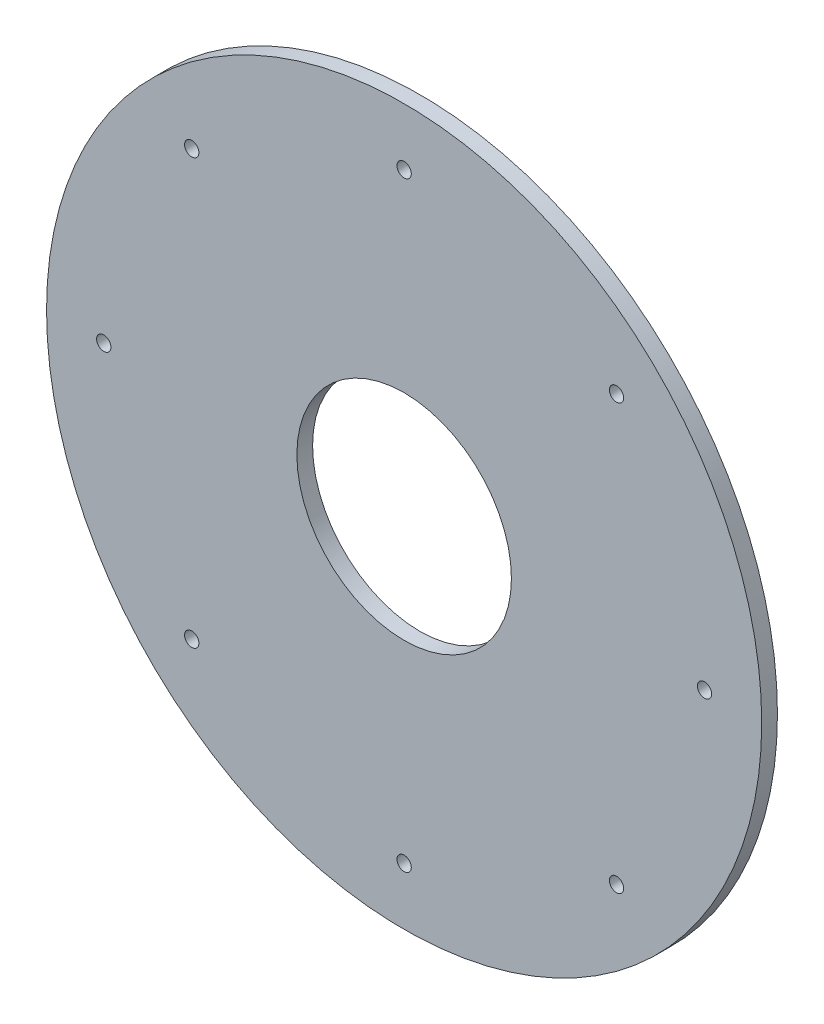
ISO-10303-21;
HEADER;
FILE_DESCRIPTION(('STEP AP214'),'2;1');
FILE_NAME('part.step','',(''),(''),'','','');
FILE_SCHEMA(('AUTOMOTIVE_DESIGN { 1 0 10303 214 1 1 1 1 }'));
ENDSEC;
DATA;
#1=APPLICATION_CONTEXT('core data for automotive mechanical design processes');
#2=APPLICATION_PROTOCOL_DEFINITION('international standard','automotive_design',2000,#1);
#3=PRODUCT_CONTEXT('',#1,'mechanical');
#4=PRODUCT('Part','Part','',(#3));
#5=PRODUCT_RELATED_PRODUCT_CATEGORY('part','',(#4));
#6=PRODUCT_DEFINITION_FORMATION('','',#4);
#7=PRODUCT_DEFINITION_CONTEXT('part definition',#1,'design');
#8=PRODUCT_DEFINITION('design','',#6,#7);
#9=PRODUCT_DEFINITION_SHAPE('','',#8);
#10=(LENGTH_UNIT() NAMED_UNIT(*) SI_UNIT(.MILLI.,.METRE.));
#11=(NAMED_UNIT(*) PLANE_ANGLE_UNIT() SI_UNIT($,.RADIAN.));
#12=(NAMED_UNIT(*) SI_UNIT($,.STERADIAN.) SOLID_ANGLE_UNIT());
#13=UNCERTAINTY_MEASURE_WITH_UNIT(LENGTH_MEASURE(1.E-05),#10,'distance_accuracy_value','');
#14=(GEOMETRIC_REPRESENTATION_CONTEXT(3) GLOBAL_UNCERTAINTY_ASSIGNED_CONTEXT((#13)) GLOBAL_UNIT_ASSIGNED_CONTEXT((#10,
#11,#12)) REPRESENTATION_CONTEXT('',''));
#15=CARTESIAN_POINT('',(0.,0.,0.));
#16=DIRECTION('',(0.,0.,1.));
#17=DIRECTION('',(1.,0.,0.));
#18=AXIS2_PLACEMENT_3D('',#15,#16,#17);
#19=CARTESIAN_POINT('',(0.,0.,11.));
#20=DIRECTION('',(0.,0.,1.));
#21=DIRECTION('',(1.,0.,0.));
#22=AXIS2_PLACEMENT_3D('',#19,#20,#21);
#23=PLANE('',#22);
#24=CARTESIAN_POINT('',(0.,210.,11.));
#25=DIRECTION('',(0.,0.,1.));
#26=DIRECTION('',(1.,0.,0.));
#27=AXIS2_PLACEMENT_3D('',#24,#25,#26);
#28=CIRCLE('',#27,5.);
#29=CARTESIAN_POINT('',(5.,210.,11.));
#30=VERTEX_POINT('',#29);
#31=EDGE_CURVE('E91',#30,#30,#28,.T.);
#32=ORIENTED_EDGE('',*,*,#31,.F.);
#33=EDGE_LOOP('',(#32));
#34=FACE_BOUND('',#33,.T.);
#35=CARTESIAN_POINT('',(148.492424049175,148.492424049175,11.));
#36=DIRECTION('',(0.,0.,1.));
#37=DIRECTION('',(1.,0.,0.));
#38=AXIS2_PLACEMENT_3D('',#35,#36,#37);
#39=CIRCLE('',#38,4.99999999999999);
#40=CARTESIAN_POINT('',(153.492424049175,148.492424049175,11.));
#41=VERTEX_POINT('',#40);
#42=EDGE_CURVE('E85',#41,#41,#39,.T.);
#43=ORIENTED_EDGE('',*,*,#42,.F.);
#44=EDGE_LOOP('',(#43));
#45=FACE_BOUND('',#44,.T.);
#46=CARTESIAN_POINT('',(210.,0.,11.));
#47=DIRECTION('',(0.,0.,1.));
#48=DIRECTION('',(1.,0.,0.));
#49=AXIS2_PLACEMENT_3D('',#46,#47,#48);
#50=CIRCLE('',#49,5.00000000000002);
#51=CARTESIAN_POINT('',(215.,0.,11.));
#52=VERTEX_POINT('',#51);
#53=EDGE_CURVE('E79',#52,#52,#50,.T.);
#54=ORIENTED_EDGE('',*,*,#53,.F.);
#55=EDGE_LOOP('',(#54));
#56=FACE_BOUND('',#55,.T.);
#57=CARTESIAN_POINT('',(148.492424049175,-148.492424049175,11.));
#58=DIRECTION('',(0.,0.,1.));
#59=DIRECTION('',(1.,0.,0.));
#60=AXIS2_PLACEMENT_3D('',#57,#58,#59);
#61=CIRCLE('',#60,5.00000000000002);
#62=CARTESIAN_POINT('',(153.492424049175,-148.492424049175,11.));
#63=VERTEX_POINT('',#62);
#64=EDGE_CURVE('E73',#63,#63,#61,.T.);
#65=ORIENTED_EDGE('',*,*,#64,.F.);
#66=EDGE_LOOP('',(#65));
#67=FACE_BOUND('',#66,.T.);
#68=CARTESIAN_POINT('',(0.,-210.,11.));
#69=DIRECTION('',(0.,0.,1.));
#70=DIRECTION('',(1.,0.,0.));
#71=AXIS2_PLACEMENT_3D('',#68,#69,#70);
#72=CIRCLE('',#71,5.00000000000001);
#73=CARTESIAN_POINT('',(5.00000000000003,-210.,11.));
#74=VERTEX_POINT('',#73);
#75=EDGE_CURVE('E67',#74,#74,#72,.T.);
#76=ORIENTED_EDGE('',*,*,#75,.F.);
#77=EDGE_LOOP('',(#76));
#78=FACE_BOUND('',#77,.T.);
#79=CARTESIAN_POINT('',(-148.492424049175,-148.492424049175,11.));
#80=DIRECTION('',(0.,0.,1.));
#81=DIRECTION('',(1.,0.,0.));
#82=AXIS2_PLACEMENT_3D('',#79,#80,#81);
#83=CIRCLE('',#82,4.99999999999999);
#84=CARTESIAN_POINT('',(-143.492424049175,-148.492424049175,11.));
#85=VERTEX_POINT('',#84);
#86=EDGE_CURVE('E61',#85,#85,#83,.T.);
#87=ORIENTED_EDGE('',*,*,#86,.F.);
#88=EDGE_LOOP('',(#87));
#89=FACE_BOUND('',#88,.T.);
#90=CARTESIAN_POINT('',(-210.,0.,11.));
#91=DIRECTION('',(0.,0.,1.));
#92=DIRECTION('',(1.,0.,0.));
#93=AXIS2_PLACEMENT_3D('',#90,#91,#92);
#94=CIRCLE('',#93,4.99999999999999);
#95=CARTESIAN_POINT('',(-205.,0.,11.));
#96=VERTEX_POINT('',#95);
#97=EDGE_CURVE('E55',#96,#96,#94,.T.);
#98=ORIENTED_EDGE('',*,*,#97,.F.);
#99=EDGE_LOOP('',(#98));
#100=FACE_BOUND('',#99,.T.);
#101=CARTESIAN_POINT('',(-148.492424049175,148.492424049175,11.));
#102=DIRECTION('',(0.,0.,1.));
#103=DIRECTION('',(1.,0.,0.));
#104=AXIS2_PLACEMENT_3D('',#101,#102,#103);
#105=CIRCLE('',#104,4.99999999999999);
#106=CARTESIAN_POINT('',(-143.492424049175,148.492424049175,11.));
#107=VERTEX_POINT('',#106);
#108=EDGE_CURVE('E49',#107,#107,#105,.T.);
#109=ORIENTED_EDGE('',*,*,#108,.F.);
#110=EDGE_LOOP('',(#109));
#111=FACE_BOUND('',#110,.T.);
#112=CARTESIAN_POINT('',(0.,0.,11.));
#113=DIRECTION('',(0.,0.,1.));
#114=DIRECTION('',(1.,0.,0.));
#115=AXIS2_PLACEMENT_3D('',#112,#113,#114);
#116=CIRCLE('',#115,250.);
#117=CARTESIAN_POINT('',(250.,0.,11.));
#118=VERTEX_POINT('',#117);
#119=EDGE_CURVE('E10',#118,#118,#116,.T.);
#120=ORIENTED_EDGE('',*,*,#119,.T.);
#121=EDGE_LOOP('',(#120));
#122=FACE_BOUND('',#121,.T.);
#123=CARTESIAN_POINT('',(0.,0.,11.));
#124=DIRECTION('',(0.,0.,1.));
#125=DIRECTION('',(1.,0.,0.));
#126=AXIS2_PLACEMENT_3D('',#123,#124,#125);
#127=CIRCLE('',#126,75.);
#128=CARTESIAN_POINT('',(75.,0.,11.));
#129=VERTEX_POINT('',#128);
#130=EDGE_CURVE('E41',#129,#129,#127,.T.);
#131=ORIENTED_EDGE('',*,*,#130,.F.);
#132=EDGE_LOOP('',(#131));
#133=FACE_BOUND('',#132,.T.);
#134=ADVANCED_FACE('F30',(#34,#45,#56,#67,#78,#89,#100,#111,#122,#133),#23,.T.);
#135=CARTESIAN_POINT('',(0.,0.,0.));
#136=DIRECTION('',(0.,0.,1.));
#137=DIRECTION('',(1.,0.,0.));
#138=AXIS2_PLACEMENT_3D('',#135,#136,#137);
#139=PLANE('',#138);
#140=CARTESIAN_POINT('',(0.,210.,0.));
#141=DIRECTION('',(0.,0.,1.));
#142=DIRECTION('',(1.,0.,0.));
#143=AXIS2_PLACEMENT_3D('',#140,#141,#142);
#144=CIRCLE('',#143,5.);
#145=CARTESIAN_POINT('',(5.,210.,0.));
#146=VERTEX_POINT('',#145);
#147=EDGE_CURVE('E46',#146,#146,#144,.T.);
#148=ORIENTED_EDGE('',*,*,#147,.T.);
#149=EDGE_LOOP('',(#148));
#150=FACE_BOUND('',#149,.T.);
#151=CARTESIAN_POINT('',(148.492424049175,148.492424049175,0.));
#152=DIRECTION('',(0.,0.,1.));
#153=DIRECTION('',(1.,0.,0.));
#154=AXIS2_PLACEMENT_3D('',#151,#152,#153);
#155=CIRCLE('',#154,4.99999999999999);
#156=CARTESIAN_POINT('',(153.492424049175,148.492424049175,0.));
#157=VERTEX_POINT('',#156);
#158=EDGE_CURVE('E88',#157,#157,#155,.T.);
#159=ORIENTED_EDGE('',*,*,#158,.T.);
#160=EDGE_LOOP('',(#159));
#161=FACE_BOUND('',#160,.T.);
#162=CARTESIAN_POINT('',(210.,0.,0.));
#163=DIRECTION('',(0.,0.,1.));
#164=DIRECTION('',(1.,0.,0.));
#165=AXIS2_PLACEMENT_3D('',#162,#163,#164);
#166=CIRCLE('',#165,5.00000000000002);
#167=CARTESIAN_POINT('',(215.,0.,0.));
#168=VERTEX_POINT('',#167);
#169=EDGE_CURVE('E82',#168,#168,#166,.T.);
#170=ORIENTED_EDGE('',*,*,#169,.T.);
#171=EDGE_LOOP('',(#170));
#172=FACE_BOUND('',#171,.T.);
#173=CARTESIAN_POINT('',(148.492424049175,-148.492424049175,0.));
#174=DIRECTION('',(0.,0.,1.));
#175=DIRECTION('',(1.,0.,0.));
#176=AXIS2_PLACEMENT_3D('',#173,#174,#175);
#177=CIRCLE('',#176,5.00000000000002);
#178=CARTESIAN_POINT('',(153.492424049175,-148.492424049175,0.));
#179=VERTEX_POINT('',#178);
#180=EDGE_CURVE('E76',#179,#179,#177,.T.);
#181=ORIENTED_EDGE('',*,*,#180,.T.);
#182=EDGE_LOOP('',(#181));
#183=FACE_BOUND('',#182,.T.);
#184=CARTESIAN_POINT('',(0.,-210.,0.));
#185=DIRECTION('',(0.,0.,1.));
#186=DIRECTION('',(1.,0.,0.));
#187=AXIS2_PLACEMENT_3D('',#184,#185,#186);
#188=CIRCLE('',#187,5.00000000000001);
#189=CARTESIAN_POINT('',(5.00000000000003,-210.,0.));
#190=VERTEX_POINT('',#189);
#191=EDGE_CURVE('E70',#190,#190,#188,.T.);
#192=ORIENTED_EDGE('',*,*,#191,.T.);
#193=EDGE_LOOP('',(#192));
#194=FACE_BOUND('',#193,.T.);
#195=CARTESIAN_POINT('',(-148.492424049175,-148.492424049175,0.));
#196=DIRECTION('',(0.,0.,1.));
#197=DIRECTION('',(1.,0.,0.));
#198=AXIS2_PLACEMENT_3D('',#195,#196,#197);
#199=CIRCLE('',#198,4.99999999999999);
#200=CARTESIAN_POINT('',(-143.492424049175,-148.492424049175,0.));
#201=VERTEX_POINT('',#200);
#202=EDGE_CURVE('E64',#201,#201,#199,.T.);
#203=ORIENTED_EDGE('',*,*,#202,.T.);
#204=EDGE_LOOP('',(#203));
#205=FACE_BOUND('',#204,.T.);
#206=CARTESIAN_POINT('',(-210.,0.,0.));
#207=DIRECTION('',(0.,0.,1.));
#208=DIRECTION('',(1.,0.,0.));
#209=AXIS2_PLACEMENT_3D('',#206,#207,#208);
#210=CIRCLE('',#209,4.99999999999999);
#211=CARTESIAN_POINT('',(-205.,0.,0.));
#212=VERTEX_POINT('',#211);
#213=EDGE_CURVE('E58',#212,#212,#210,.T.);
#214=ORIENTED_EDGE('',*,*,#213,.T.);
#215=EDGE_LOOP('',(#214));
#216=FACE_BOUND('',#215,.T.);
#217=CARTESIAN_POINT('',(-148.492424049175,148.492424049175,0.));
#218=DIRECTION('',(0.,0.,1.));
#219=DIRECTION('',(1.,0.,0.));
#220=AXIS2_PLACEMENT_3D('',#217,#218,#219);
#221=CIRCLE('',#220,4.99999999999999);
#222=CARTESIAN_POINT('',(-143.492424049175,148.492424049175,0.));
#223=VERTEX_POINT('',#222);
#224=EDGE_CURVE('E52',#223,#223,#221,.T.);
#225=ORIENTED_EDGE('',*,*,#224,.T.);
#226=EDGE_LOOP('',(#225));
#227=FACE_BOUND('',#226,.T.);
#228=CARTESIAN_POINT('',(0.,0.,0.));
#229=DIRECTION('',(0.,0.,1.));
#230=DIRECTION('',(1.,0.,0.));
#231=AXIS2_PLACEMENT_3D('',#228,#229,#230);
#232=CIRCLE('',#231,250.);
#233=CARTESIAN_POINT('',(250.,0.,0.));
#234=VERTEX_POINT('',#233);
#235=EDGE_CURVE('E34',#234,#234,#232,.T.);
#236=ORIENTED_EDGE('',*,*,#235,.F.);
#237=EDGE_LOOP('',(#236));
#238=FACE_BOUND('',#237,.T.);
#239=CARTESIAN_POINT('',(0.,0.,0.));
#240=DIRECTION('',(0.,0.,1.));
#241=DIRECTION('',(1.,0.,0.));
#242=AXIS2_PLACEMENT_3D('',#239,#240,#241);
#243=CIRCLE('',#242,75.);
#244=CARTESIAN_POINT('',(75.,0.,0.));
#245=VERTEX_POINT('',#244);
#246=EDGE_CURVE('E43',#245,#245,#243,.T.);
#247=ORIENTED_EDGE('',*,*,#246,.T.);
#248=EDGE_LOOP('',(#247));
#249=FACE_BOUND('',#248,.T.);
#250=ADVANCED_FACE('F97',(#150,#161,#172,#183,#194,#205,#216,#227,#238,#249),#139,.F.);
#251=CARTESIAN_POINT('',(0.,0.,11.));
#252=DIRECTION('',(0.,0.,-1.));
#253=DIRECTION('',(-1.,0.,0.));
#254=AXIS2_PLACEMENT_3D('',#251,#252,#253);
#255=CYLINDRICAL_SURFACE('',#254,250.);
#256=ORIENTED_EDGE('',*,*,#119,.F.);
#257=EDGE_LOOP('',(#256));
#258=FACE_BOUND('',#257,.T.);
#259=ORIENTED_EDGE('',*,*,#235,.T.);
#260=EDGE_LOOP('',(#259));
#261=FACE_BOUND('',#260,.T.);
#262=ADVANCED_FACE('F32',(#258,#261),#255,.T.);
#263=CARTESIAN_POINT('',(0.,0.,11.));
#264=DIRECTION('',(0.,0.,-1.));
#265=DIRECTION('',(-1.,0.,0.));
#266=AXIS2_PLACEMENT_3D('',#263,#264,#265);
#267=CYLINDRICAL_SURFACE('',#266,75.);
#268=ORIENTED_EDGE('',*,*,#130,.T.);
#269=EDGE_LOOP('',(#268));
#270=FACE_BOUND('',#269,.T.);
#271=ORIENTED_EDGE('',*,*,#246,.F.);
#272=EDGE_LOOP('',(#271));
#273=FACE_BOUND('',#272,.T.);
#274=ADVANCED_FACE('F126',(#270,#273),#267,.F.);
#275=CARTESIAN_POINT('',(-148.492424049175,148.492424049175,0.));
#276=DIRECTION('',(0.,0.,1.));
#277=DIRECTION('',(1.,0.,0.));
#278=AXIS2_PLACEMENT_3D('',#275,#276,#277);
#279=CYLINDRICAL_SURFACE('',#278,4.99999999999999);
#280=ORIENTED_EDGE('',*,*,#224,.F.);
#281=EDGE_LOOP('',(#280));
#282=FACE_BOUND('',#281,.T.);
#283=ORIENTED_EDGE('',*,*,#108,.T.);
#284=EDGE_LOOP('',(#283));
#285=FACE_BOUND('',#284,.T.);
#286=ADVANCED_FACE('F129',(#282,#285),#279,.F.);
#287=CARTESIAN_POINT('',(-210.,0.,0.));
#288=DIRECTION('',(0.,0.,1.));
#289=DIRECTION('',(1.,0.,0.));
#290=AXIS2_PLACEMENT_3D('',#287,#288,#289);
#291=CYLINDRICAL_SURFACE('',#290,4.99999999999999);
#292=ORIENTED_EDGE('',*,*,#213,.F.);
#293=EDGE_LOOP('',(#292));
#294=FACE_BOUND('',#293,.T.);
#295=ORIENTED_EDGE('',*,*,#97,.T.);
#296=EDGE_LOOP('',(#295));
#297=FACE_BOUND('',#296,.T.);
#298=ADVANCED_FACE('F141',(#294,#297),#291,.F.);
#299=CARTESIAN_POINT('',(-148.492424049175,-148.492424049175,0.));
#300=DIRECTION('',(0.,0.,1.));
#301=DIRECTION('',(1.,0.,0.));
#302=AXIS2_PLACEMENT_3D('',#299,#300,#301);
#303=CYLINDRICAL_SURFACE('',#302,4.99999999999999);
#304=ORIENTED_EDGE('',*,*,#202,.F.);
#305=EDGE_LOOP('',(#304));
#306=FACE_BOUND('',#305,.T.);
#307=ORIENTED_EDGE('',*,*,#86,.T.);
#308=EDGE_LOOP('',(#307));
#309=FACE_BOUND('',#308,.T.);
#310=ADVANCED_FACE('F145',(#306,#309),#303,.F.);
#311=CARTESIAN_POINT('',(0.,-210.,0.));
#312=DIRECTION('',(0.,0.,1.));
#313=DIRECTION('',(1.,0.,0.));
#314=AXIS2_PLACEMENT_3D('',#311,#312,#313);
#315=CYLINDRICAL_SURFACE('',#314,5.00000000000001);
#316=ORIENTED_EDGE('',*,*,#191,.F.);
#317=EDGE_LOOP('',(#316));
#318=FACE_BOUND('',#317,.T.);
#319=ORIENTED_EDGE('',*,*,#75,.T.);
#320=EDGE_LOOP('',(#319));
#321=FACE_BOUND('',#320,.T.);
#322=ADVANCED_FACE('F149',(#318,#321),#315,.F.);
#323=CARTESIAN_POINT('',(148.492424049175,-148.492424049175,0.));
#324=DIRECTION('',(0.,0.,1.));
#325=DIRECTION('',(1.,0.,0.));
#326=AXIS2_PLACEMENT_3D('',#323,#324,#325);
#327=CYLINDRICAL_SURFACE('',#326,5.00000000000002);
#328=ORIENTED_EDGE('',*,*,#180,.F.);
#329=EDGE_LOOP('',(#328));
#330=FACE_BOUND('',#329,.T.);
#331=ORIENTED_EDGE('',*,*,#64,.T.);
#332=EDGE_LOOP('',(#331));
#333=FACE_BOUND('',#332,.T.);
#334=ADVANCED_FACE('F153',(#330,#333),#327,.F.);
#335=CARTESIAN_POINT('',(210.,0.,0.));
#336=DIRECTION('',(0.,0.,1.));
#337=DIRECTION('',(1.,0.,0.));
#338=AXIS2_PLACEMENT_3D('',#335,#336,#337);
#339=CYLINDRICAL_SURFACE('',#338,5.00000000000002);
#340=ORIENTED_EDGE('',*,*,#169,.F.);
#341=EDGE_LOOP('',(#340));
#342=FACE_BOUND('',#341,.T.);
#343=ORIENTED_EDGE('',*,*,#53,.T.);
#344=EDGE_LOOP('',(#343));
#345=FACE_BOUND('',#344,.T.);
#346=ADVANCED_FACE('F157',(#342,#345),#339,.F.);
#347=CARTESIAN_POINT('',(148.492424049175,148.492424049175,0.));
#348=DIRECTION('',(0.,0.,1.));
#349=DIRECTION('',(1.,0.,0.));
#350=AXIS2_PLACEMENT_3D('',#347,#348,#349);
#351=CYLINDRICAL_SURFACE('',#350,4.99999999999999);
#352=ORIENTED_EDGE('',*,*,#158,.F.);
#353=EDGE_LOOP('',(#352));
#354=FACE_BOUND('',#353,.T.);
#355=ORIENTED_EDGE('',*,*,#42,.T.);
#356=EDGE_LOOP('',(#355));
#357=FACE_BOUND('',#356,.T.);
#358=ADVANCED_FACE('F103',(#354,#357),#351,.F.);
#359=CARTESIAN_POINT('',(0.,210.,0.));
#360=DIRECTION('',(0.,0.,1.));
#361=DIRECTION('',(1.,0.,0.));
#362=AXIS2_PLACEMENT_3D('',#359,#360,#361);
#363=CYLINDRICAL_SURFACE('',#362,5.);
#364=ORIENTED_EDGE('',*,*,#147,.F.);
#365=EDGE_LOOP('',(#364));
#366=FACE_BOUND('',#365,.T.);
#367=ORIENTED_EDGE('',*,*,#31,.T.);
#368=EDGE_LOOP('',(#367));
#369=FACE_BOUND('',#368,.T.);
#370=ADVANCED_FACE('F100',(#366,#369),#363,.F.);
#371=CLOSED_SHELL('',(#134,#250,#262,#274,#286,#298,#310,#322,#334,#346,#358,#370));
#372=MANIFOLD_SOLID_BREP('B2',#371);
#373=ADVANCED_BREP_SHAPE_REPRESENTATION('',(#18,#372),#14);
#374=SHAPE_DEFINITION_REPRESENTATION(#9,#373);
ENDSEC;
END-ISO-10303-21;
